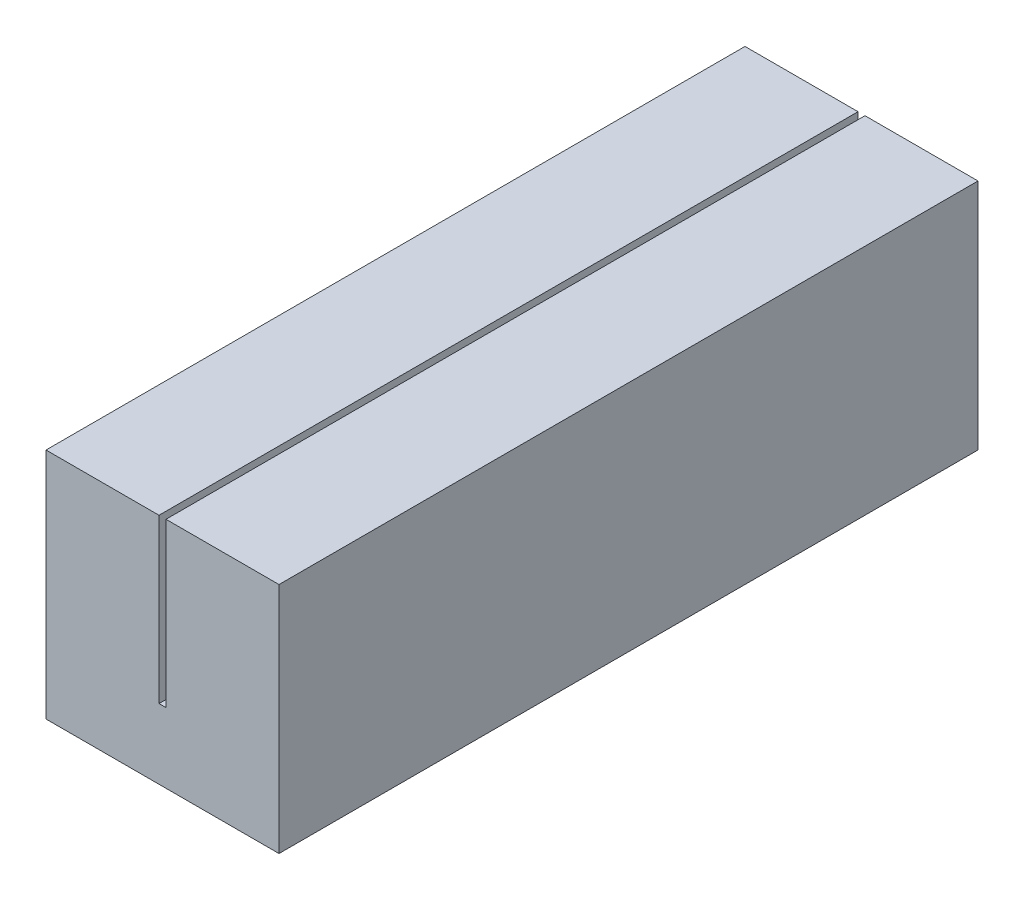
ISO-10303-21;
HEADER;
FILE_DESCRIPTION(('STEP AP214'),'2;1');
FILE_NAME('part.step','',(''),(''),'','','');
FILE_SCHEMA(('AUTOMOTIVE_DESIGN { 1 0 10303 214 1 1 1 1 }'));
ENDSEC;
DATA;
#1=APPLICATION_CONTEXT('core data for automotive mechanical design processes');
#2=APPLICATION_PROTOCOL_DEFINITION('international standard','automotive_design',2000,#1);
#3=PRODUCT_CONTEXT('',#1,'mechanical');
#4=PRODUCT('Part','Part','',(#3));
#5=PRODUCT_RELATED_PRODUCT_CATEGORY('part','',(#4));
#6=PRODUCT_DEFINITION_FORMATION('','',#4);
#7=PRODUCT_DEFINITION_CONTEXT('part definition',#1,'design');
#8=PRODUCT_DEFINITION('design','',#6,#7);
#9=PRODUCT_DEFINITION_SHAPE('','',#8);
#10=(LENGTH_UNIT() NAMED_UNIT(*) SI_UNIT(.MILLI.,.METRE.));
#11=(NAMED_UNIT(*) PLANE_ANGLE_UNIT() SI_UNIT($,.RADIAN.));
#12=(NAMED_UNIT(*) SI_UNIT($,.STERADIAN.) SOLID_ANGLE_UNIT());
#13=UNCERTAINTY_MEASURE_WITH_UNIT(LENGTH_MEASURE(1.E-05),#10,'distance_accuracy_value','');
#14=(GEOMETRIC_REPRESENTATION_CONTEXT(3) GLOBAL_UNCERTAINTY_ASSIGNED_CONTEXT((#13)) GLOBAL_UNIT_ASSIGNED_CONTEXT((#10,
#11,#12)) REPRESENTATION_CONTEXT('',''));
#15=CARTESIAN_POINT('',(0.,0.,0.));
#16=DIRECTION('',(0.,0.,1.));
#17=DIRECTION('',(1.,0.,0.));
#18=AXIS2_PLACEMENT_3D('',#15,#16,#17);
#19=CARTESIAN_POINT('',(4.99999999999999,5.,15.));
#20=DIRECTION('',(-1.,0.,0.));
#21=DIRECTION('',(0.,0.,1.));
#22=AXIS2_PLACEMENT_3D('',#19,#20,#21);
#23=PLANE('',#22);
#24=DIRECTION('',(0.,1.,0.));
#25=VECTOR('',#24,1.);
#26=CARTESIAN_POINT('',(4.99999999999999,5.,-15.));
#27=LINE('',#26,#25);
#28=CARTESIAN_POINT('',(4.99999999999999,-5.,-15.));
#29=VERTEX_POINT('',#28);
#30=CARTESIAN_POINT('',(4.99999999999999,5.,-15.));
#31=VERTEX_POINT('',#30);
#32=EDGE_CURVE('E140',#29,#31,#27,.T.);
#33=ORIENTED_EDGE('',*,*,#32,.T.);
#34=DIRECTION('',(0.,0.,-1.));
#35=VECTOR('',#34,1.);
#36=CARTESIAN_POINT('',(4.99999999999999,5.,15.));
#37=LINE('',#36,#35);
#38=CARTESIAN_POINT('',(4.99999999999999,5.,15.));
#39=VERTEX_POINT('',#38);
#40=EDGE_CURVE('E11',#39,#31,#37,.T.);
#41=ORIENTED_EDGE('',*,*,#40,.F.);
#42=DIRECTION('',(0.,1.,0.));
#43=VECTOR('',#42,1.);
#44=CARTESIAN_POINT('',(4.99999999999999,5.,15.));
#45=LINE('',#44,#43);
#46=CARTESIAN_POINT('',(4.99999999999999,-5.,15.));
#47=VERTEX_POINT('',#46);
#48=EDGE_CURVE('E162',#47,#39,#45,.T.);
#49=ORIENTED_EDGE('',*,*,#48,.F.);
#50=DIRECTION('',(0.,0.,-1.));
#51=VECTOR('',#50,1.);
#52=CARTESIAN_POINT('',(4.99999999999999,-5.,15.));
#53=LINE('',#52,#51);
#54=EDGE_CURVE('E136',#47,#29,#53,.T.);
#55=ORIENTED_EDGE('',*,*,#54,.T.);
#56=EDGE_LOOP('',(#33,#41,#49,#55));
#57=FACE_BOUND('',#56,.T.);
#58=ADVANCED_FACE('F39',(#57),#23,.F.);
#59=CARTESIAN_POINT('',(0.149999999999991,5.,15.));
#60=DIRECTION('',(0.,-1.,0.));
#61=DIRECTION('',(1.,0.,0.));
#62=AXIS2_PLACEMENT_3D('',#59,#60,#61);
#63=PLANE('',#62);
#64=DIRECTION('',(-1.,0.,0.));
#65=VECTOR('',#64,1.);
#66=CARTESIAN_POINT('',(0.149999999999991,5.,-15.));
#67=LINE('',#66,#65);
#68=CARTESIAN_POINT('',(0.149999999999991,5.,-15.));
#69=VERTEX_POINT('',#68);
#70=EDGE_CURVE('E144',#31,#69,#67,.T.);
#71=ORIENTED_EDGE('',*,*,#70,.T.);
#72=DIRECTION('',(0.,0.,-1.));
#73=VECTOR('',#72,1.);
#74=CARTESIAN_POINT('',(0.149999999999991,5.,15.));
#75=LINE('',#74,#73);
#76=CARTESIAN_POINT('',(0.149999999999991,5.,15.));
#77=VERTEX_POINT('',#76);
#78=EDGE_CURVE('E48',#77,#69,#75,.T.);
#79=ORIENTED_EDGE('',*,*,#78,.F.);
#80=DIRECTION('',(-1.,0.,0.));
#81=VECTOR('',#80,1.);
#82=CARTESIAN_POINT('',(0.149999999999991,5.,15.));
#83=LINE('',#82,#81);
#84=EDGE_CURVE('E99',#39,#77,#83,.T.);
#85=ORIENTED_EDGE('',*,*,#84,.F.);
#86=ORIENTED_EDGE('',*,*,#40,.T.);
#87=EDGE_LOOP('',(#71,#79,#85,#86));
#88=FACE_BOUND('',#87,.T.);
#89=ADVANCED_FACE('F208',(#88),#63,.F.);
#90=CARTESIAN_POINT('',(0.15,-2.,15.));
#91=DIRECTION('',(1.,0.,0.));
#92=DIRECTION('',(0.,1.,0.));
#93=AXIS2_PLACEMENT_3D('',#90,#91,#92);
#94=PLANE('',#93);
#95=DIRECTION('',(0.,-1.,0.));
#96=VECTOR('',#95,1.);
#97=CARTESIAN_POINT('',(0.15,-2.,-15.));
#98=LINE('',#97,#96);
#99=CARTESIAN_POINT('',(0.15,-2.,-15.));
#100=VERTEX_POINT('',#99);
#101=EDGE_CURVE('E147',#69,#100,#98,.T.);
#102=ORIENTED_EDGE('',*,*,#101,.T.);
#103=DIRECTION('',(0.,0.,-1.));
#104=VECTOR('',#103,1.);
#105=CARTESIAN_POINT('',(0.15,-2.,15.));
#106=LINE('',#105,#104);
#107=CARTESIAN_POINT('',(0.15,-2.,15.));
#108=VERTEX_POINT('',#107);
#109=EDGE_CURVE('E173',#108,#100,#106,.T.);
#110=ORIENTED_EDGE('',*,*,#109,.F.);
#111=DIRECTION('',(0.,-1.,0.));
#112=VECTOR('',#111,1.);
#113=CARTESIAN_POINT('',(0.15,-2.,15.));
#114=LINE('',#113,#112);
#115=EDGE_CURVE('E183',#77,#108,#114,.T.);
#116=ORIENTED_EDGE('',*,*,#115,.F.);
#117=ORIENTED_EDGE('',*,*,#78,.T.);
#118=EDGE_LOOP('',(#102,#110,#116,#117));
#119=FACE_BOUND('',#118,.T.);
#120=ADVANCED_FACE('F181',(#119),#94,.F.);
#121=CARTESIAN_POINT('',(-0.15,-2.,15.));
#122=DIRECTION('',(0.,-1.,0.));
#123=DIRECTION('',(1.,0.,0.));
#124=AXIS2_PLACEMENT_3D('',#121,#122,#123);
#125=PLANE('',#124);
#126=DIRECTION('',(-1.,0.,0.));
#127=VECTOR('',#126,1.);
#128=CARTESIAN_POINT('',(-0.15,-2.,-15.));
#129=LINE('',#128,#127);
#130=CARTESIAN_POINT('',(-0.15,-2.,-15.));
#131=VERTEX_POINT('',#130);
#132=EDGE_CURVE('E150',#100,#131,#129,.T.);
#133=ORIENTED_EDGE('',*,*,#132,.T.);
#134=DIRECTION('',(0.,0.,-1.));
#135=VECTOR('',#134,1.);
#136=CARTESIAN_POINT('',(-0.15,-2.,15.));
#137=LINE('',#136,#135);
#138=CARTESIAN_POINT('',(-0.15,-2.,15.));
#139=VERTEX_POINT('',#138);
#140=EDGE_CURVE('E169',#139,#131,#137,.T.);
#141=ORIENTED_EDGE('',*,*,#140,.F.);
#142=DIRECTION('',(-1.,0.,0.));
#143=VECTOR('',#142,1.);
#144=CARTESIAN_POINT('',(-0.15,-2.,15.));
#145=LINE('',#144,#143);
#146=EDGE_CURVE('E196',#108,#139,#145,.T.);
#147=ORIENTED_EDGE('',*,*,#146,.F.);
#148=ORIENTED_EDGE('',*,*,#109,.T.);
#149=EDGE_LOOP('',(#133,#141,#147,#148));
#150=FACE_BOUND('',#149,.T.);
#151=ADVANCED_FACE('F191',(#150),#125,.F.);
#152=CARTESIAN_POINT('',(-0.149999999999991,5.,15.));
#153=DIRECTION('',(-1.,0.,0.));
#154=DIRECTION('',(0.,-1.,0.));
#155=AXIS2_PLACEMENT_3D('',#152,#153,#154);
#156=PLANE('',#155);
#157=DIRECTION('',(0.,1.,0.));
#158=VECTOR('',#157,1.);
#159=CARTESIAN_POINT('',(-0.149999999999991,5.,-15.));
#160=LINE('',#159,#158);
#161=CARTESIAN_POINT('',(-0.149999999999991,5.,-15.));
#162=VERTEX_POINT('',#161);
#163=EDGE_CURVE('E153',#131,#162,#160,.T.);
#164=ORIENTED_EDGE('',*,*,#163,.T.);
#165=DIRECTION('',(0.,0.,-1.));
#166=VECTOR('',#165,1.);
#167=CARTESIAN_POINT('',(-0.149999999999991,5.,15.));
#168=LINE('',#167,#166);
#169=CARTESIAN_POINT('',(-0.149999999999991,5.,15.));
#170=VERTEX_POINT('',#169);
#171=EDGE_CURVE('E129',#170,#162,#168,.T.);
#172=ORIENTED_EDGE('',*,*,#171,.F.);
#173=DIRECTION('',(0.,1.,0.));
#174=VECTOR('',#173,1.);
#175=CARTESIAN_POINT('',(-0.149999999999991,5.,15.));
#176=LINE('',#175,#174);
#177=EDGE_CURVE('E118',#139,#170,#176,.T.);
#178=ORIENTED_EDGE('',*,*,#177,.F.);
#179=ORIENTED_EDGE('',*,*,#140,.T.);
#180=EDGE_LOOP('',(#164,#172,#178,#179));
#181=FACE_BOUND('',#180,.T.);
#182=ADVANCED_FACE('F194',(#181),#156,.F.);
#183=CARTESIAN_POINT('',(-5.00000000000002,5.,15.));
#184=DIRECTION('',(0.,-1.,0.));
#185=DIRECTION('',(1.,0.,0.));
#186=AXIS2_PLACEMENT_3D('',#183,#184,#185);
#187=PLANE('',#186);
#188=DIRECTION('',(-1.,0.,0.));
#189=VECTOR('',#188,1.);
#190=CARTESIAN_POINT('',(-5.00000000000002,5.,-15.));
#191=LINE('',#190,#189);
#192=CARTESIAN_POINT('',(-5.00000000000002,5.,-15.));
#193=VERTEX_POINT('',#192);
#194=EDGE_CURVE('E127',#162,#193,#191,.T.);
#195=ORIENTED_EDGE('',*,*,#194,.T.);
#196=DIRECTION('',(0.,0.,-1.));
#197=VECTOR('',#196,1.);
#198=CARTESIAN_POINT('',(-5.00000000000002,5.,15.));
#199=LINE('',#198,#197);
#200=CARTESIAN_POINT('',(-5.00000000000002,5.,15.));
#201=VERTEX_POINT('',#200);
#202=EDGE_CURVE('E124',#201,#193,#199,.T.);
#203=ORIENTED_EDGE('',*,*,#202,.F.);
#204=DIRECTION('',(-1.,0.,0.));
#205=VECTOR('',#204,1.);
#206=CARTESIAN_POINT('',(-5.00000000000002,5.,15.));
#207=LINE('',#206,#205);
#208=EDGE_CURVE('E112',#170,#201,#207,.T.);
#209=ORIENTED_EDGE('',*,*,#208,.F.);
#210=ORIENTED_EDGE('',*,*,#171,.T.);
#211=EDGE_LOOP('',(#195,#203,#209,#210));
#212=FACE_BOUND('',#211,.T.);
#213=ADVANCED_FACE('F125',(#212),#187,.F.);
#214=CARTESIAN_POINT('',(-5.00000000000002,5.,15.));
#215=DIRECTION('',(1.,0.,0.));
#216=DIRECTION('',(0.,1.,0.));
#217=AXIS2_PLACEMENT_3D('',#214,#215,#216);
#218=PLANE('',#217);
#219=DIRECTION('',(0.,-1.,0.));
#220=VECTOR('',#219,1.);
#221=CARTESIAN_POINT('',(-5.00000000000002,5.,-15.));
#222=LINE('',#221,#220);
#223=CARTESIAN_POINT('',(-5.00000000000002,-5.,-15.));
#224=VERTEX_POINT('',#223);
#225=EDGE_CURVE('E85',#193,#224,#222,.T.);
#226=ORIENTED_EDGE('',*,*,#225,.T.);
#227=DIRECTION('',(0.,0.,-1.));
#228=VECTOR('',#227,1.);
#229=CARTESIAN_POINT('',(-5.00000000000002,-5.,15.));
#230=LINE('',#229,#228);
#231=CARTESIAN_POINT('',(-5.00000000000002,-5.,15.));
#232=VERTEX_POINT('',#231);
#233=EDGE_CURVE('E130',#232,#224,#230,.T.);
#234=ORIENTED_EDGE('',*,*,#233,.F.);
#235=DIRECTION('',(0.,-1.,0.));
#236=VECTOR('',#235,1.);
#237=CARTESIAN_POINT('',(-5.00000000000002,5.,15.));
#238=LINE('',#237,#236);
#239=EDGE_CURVE('E116',#201,#232,#238,.T.);
#240=ORIENTED_EDGE('',*,*,#239,.F.);
#241=ORIENTED_EDGE('',*,*,#202,.T.);
#242=EDGE_LOOP('',(#226,#234,#240,#241));
#243=FACE_BOUND('',#242,.T.);
#244=ADVANCED_FACE('F132',(#243),#218,.F.);
#245=CARTESIAN_POINT('',(-5.00000000000002,-5.,15.));
#246=DIRECTION('',(0.,1.,0.));
#247=DIRECTION('',(0.,0.,1.));
#248=AXIS2_PLACEMENT_3D('',#245,#246,#247);
#249=PLANE('',#248);
#250=DIRECTION('',(1.,0.,0.));
#251=VECTOR('',#250,1.);
#252=CARTESIAN_POINT('',(-5.00000000000002,-5.,-15.));
#253=LINE('',#252,#251);
#254=EDGE_CURVE('E91',#224,#29,#253,.T.);
#255=ORIENTED_EDGE('',*,*,#254,.T.);
#256=ORIENTED_EDGE('',*,*,#54,.F.);
#257=DIRECTION('',(1.,0.,0.));
#258=VECTOR('',#257,1.);
#259=CARTESIAN_POINT('',(-5.00000000000002,-5.,15.));
#260=LINE('',#259,#258);
#261=EDGE_CURVE('E56',#232,#47,#260,.T.);
#262=ORIENTED_EDGE('',*,*,#261,.F.);
#263=ORIENTED_EDGE('',*,*,#233,.T.);
#264=EDGE_LOOP('',(#255,#256,#262,#263));
#265=FACE_BOUND('',#264,.T.);
#266=ADVANCED_FACE('F224',(#265),#249,.F.);
#267=CARTESIAN_POINT('',(0.,0.,15.));
#268=DIRECTION('',(0.,0.,1.));
#269=DIRECTION('',(1.,0.,0.));
#270=AXIS2_PLACEMENT_3D('',#267,#268,#269);
#271=PLANE('',#270);
#272=ORIENTED_EDGE('',*,*,#48,.T.);
#273=ORIENTED_EDGE('',*,*,#84,.T.);
#274=ORIENTED_EDGE('',*,*,#115,.T.);
#275=ORIENTED_EDGE('',*,*,#146,.T.);
#276=ORIENTED_EDGE('',*,*,#177,.T.);
#277=ORIENTED_EDGE('',*,*,#208,.T.);
#278=ORIENTED_EDGE('',*,*,#239,.T.);
#279=ORIENTED_EDGE('',*,*,#261,.T.);
#280=EDGE_LOOP('',(#272,#273,#274,#275,#276,#277,#278,#279));
#281=FACE_BOUND('',#280,.T.);
#282=ADVANCED_FACE('F114',(#281),#271,.T.);
#283=CARTESIAN_POINT('',(0.,0.,-15.));
#284=DIRECTION('',(0.,0.,1.));
#285=DIRECTION('',(1.,0.,0.));
#286=AXIS2_PLACEMENT_3D('',#283,#284,#285);
#287=PLANE('',#286);
#288=ORIENTED_EDGE('',*,*,#32,.F.);
#289=ORIENTED_EDGE('',*,*,#254,.F.);
#290=ORIENTED_EDGE('',*,*,#225,.F.);
#291=ORIENTED_EDGE('',*,*,#194,.F.);
#292=ORIENTED_EDGE('',*,*,#163,.F.);
#293=ORIENTED_EDGE('',*,*,#132,.F.);
#294=ORIENTED_EDGE('',*,*,#101,.F.);
#295=ORIENTED_EDGE('',*,*,#70,.F.);
#296=EDGE_LOOP('',(#288,#289,#290,#291,#292,#293,#294,#295));
#297=FACE_BOUND('',#296,.T.);
#298=ADVANCED_FACE('F187',(#297),#287,.F.);
#299=CLOSED_SHELL('',(#58,#89,#120,#151,#182,#213,#244,#266,#282,#298));
#300=MANIFOLD_SOLID_BREP('B2',#299);
#301=ADVANCED_BREP_SHAPE_REPRESENTATION('',(#18,#300),#14);
#302=SHAPE_DEFINITION_REPRESENTATION(#9,#301);
ENDSEC;
END-ISO-10303-21;
